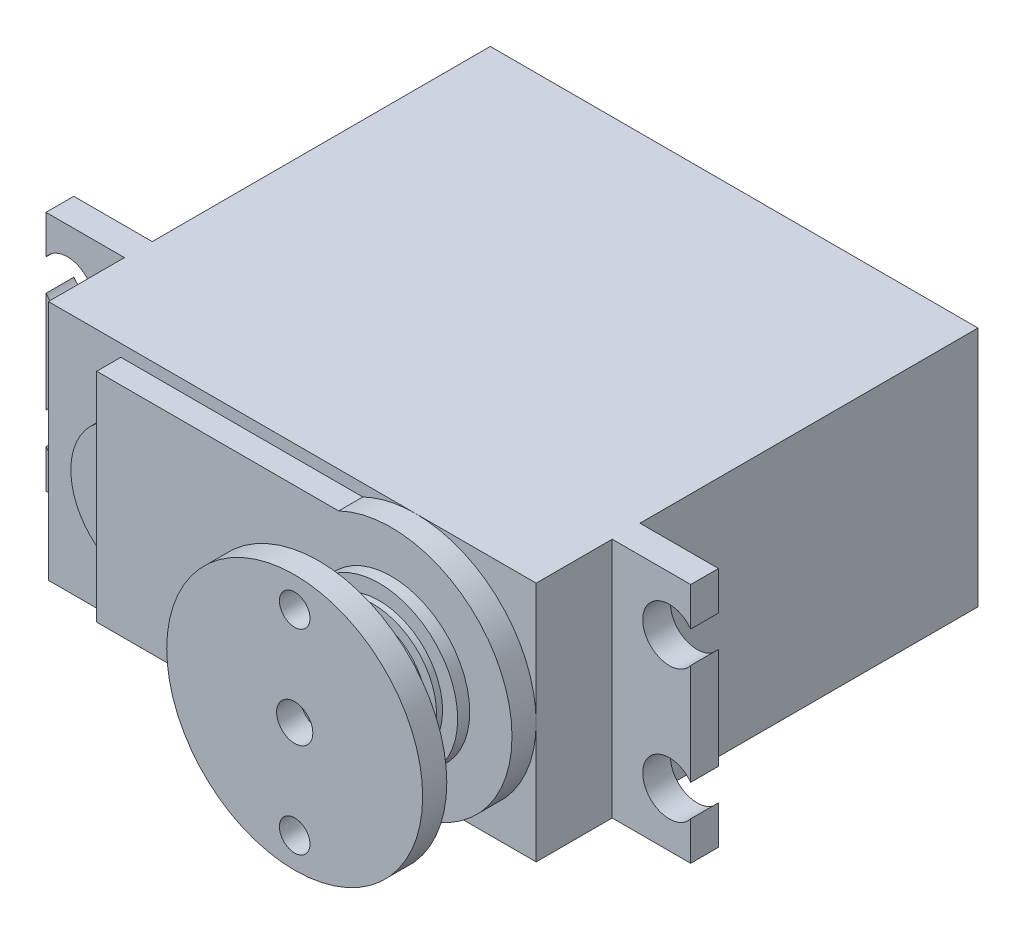
ISO-10303-21;
HEADER;
FILE_DESCRIPTION(('STEP AP214'),'2;1');
FILE_NAME('part.step','',(''),(''),'','','');
FILE_SCHEMA(('AUTOMOTIVE_DESIGN { 1 0 10303 214 1 1 1 1 }'));
ENDSEC;
DATA;
#1=APPLICATION_CONTEXT('core data for automotive mechanical design processes');
#2=APPLICATION_PROTOCOL_DEFINITION('international standard','automotive_design',2000,#1);
#3=PRODUCT_CONTEXT('',#1,'mechanical');
#4=PRODUCT('Part','Part','',(#3));
#5=PRODUCT_RELATED_PRODUCT_CATEGORY('part','',(#4));
#6=PRODUCT_DEFINITION_FORMATION('','',#4);
#7=PRODUCT_DEFINITION_CONTEXT('part definition',#1,'design');
#8=PRODUCT_DEFINITION('design','',#6,#7);
#9=PRODUCT_DEFINITION_SHAPE('','',#8);
#10=(LENGTH_UNIT() NAMED_UNIT(*) SI_UNIT(.MILLI.,.METRE.));
#11=(NAMED_UNIT(*) PLANE_ANGLE_UNIT() SI_UNIT($,.RADIAN.));
#12=(NAMED_UNIT(*) SI_UNIT($,.STERADIAN.) SOLID_ANGLE_UNIT());
#13=UNCERTAINTY_MEASURE_WITH_UNIT(LENGTH_MEASURE(1.E-05),#10,'distance_accuracy_value','');
#14=(GEOMETRIC_REPRESENTATION_CONTEXT(3) GLOBAL_UNCERTAINTY_ASSIGNED_CONTEXT((#13)) GLOBAL_UNIT_ASSIGNED_CONTEXT((#10,
#11,#12)) REPRESENTATION_CONTEXT('',''));
#15=CARTESIAN_POINT('',(0.,0.,0.));
#16=DIRECTION('',(0.,0.,1.));
#17=DIRECTION('',(1.,0.,0.));
#18=AXIS2_PLACEMENT_3D('',#15,#16,#17);
#19=CARTESIAN_POINT('',(-14.2,0.,38.6));
#20=DIRECTION('',(1.,0.,0.));
#21=DIRECTION('',(0.,0.,-1.));
#22=AXIS2_PLACEMENT_3D('',#19,#20,#21);
#23=PLANE('',#22);
#24=DIRECTION('',(0.,0.,-1.));
#25=VECTOR('',#24,1.);
#26=CARTESIAN_POINT('',(-14.2,-4.39928396599425,38.1));
#27=LINE('',#26,#25);
#28=CARTESIAN_POINT('',(-14.2,-4.39928396599425,38.1));
#29=VERTEX_POINT('',#28);
#30=CARTESIAN_POINT('',(-14.2,-4.39928396599425,36.6));
#31=VERTEX_POINT('',#30);
#32=EDGE_CURVE('E52',#29,#31,#27,.T.);
#33=ORIENTED_EDGE('',*,*,#32,.T.);
#34=DIRECTION('',(0.,-1.,0.));
#35=VECTOR('',#34,1.);
#36=CARTESIAN_POINT('',(-14.2,0.,36.6));
#37=LINE('',#36,#35);
#38=CARTESIAN_POINT('',(-14.2,-9.,36.6));
#39=VERTEX_POINT('',#38);
#40=EDGE_CURVE('E59',#31,#39,#37,.T.);
#41=ORIENTED_EDGE('',*,*,#40,.T.);
#42=DIRECTION('',(0.,0.,-1.));
#43=VECTOR('',#42,1.);
#44=CARTESIAN_POINT('',(-14.2,-9.,38.6));
#45=LINE('',#44,#43);
#46=CARTESIAN_POINT('',(-14.2,-9.,38.6));
#47=VERTEX_POINT('',#46);
#48=EDGE_CURVE('E250',#47,#39,#45,.T.);
#49=ORIENTED_EDGE('',*,*,#48,.F.);
#50=DIRECTION('',(0.,-1.,0.));
#51=VECTOR('',#50,1.);
#52=CARTESIAN_POINT('',(-14.2,0.,38.6));
#53=LINE('',#52,#51);
#54=CARTESIAN_POINT('',(-14.2,9.,38.6));
#55=VERTEX_POINT('',#54);
#56=EDGE_CURVE('E249',#55,#47,#53,.T.);
#57=ORIENTED_EDGE('',*,*,#56,.F.);
#58=DIRECTION('',(0.,0.,-1.));
#59=VECTOR('',#58,1.);
#60=CARTESIAN_POINT('',(-14.2,9.,38.6));
#61=LINE('',#60,#59);
#62=CARTESIAN_POINT('',(-14.2,9.,36.6));
#63=VERTEX_POINT('',#62);
#64=EDGE_CURVE('E261',#55,#63,#61,.T.);
#65=ORIENTED_EDGE('',*,*,#64,.T.);
#66=CARTESIAN_POINT('',(-14.2,5.10071603400575,36.6));
#67=VERTEX_POINT('',#66);
#68=EDGE_CURVE('E232',#63,#67,#37,.T.);
#69=ORIENTED_EDGE('',*,*,#68,.T.);
#70=DIRECTION('',(0.,0.,-1.));
#71=VECTOR('',#70,1.);
#72=CARTESIAN_POINT('',(-14.2,5.10071603400575,38.1));
#73=LINE('',#72,#71);
#74=CARTESIAN_POINT('',(-14.2,5.10071603400575,38.1));
#75=VERTEX_POINT('',#74);
#76=EDGE_CURVE('E221',#75,#67,#73,.T.);
#77=ORIENTED_EDGE('',*,*,#76,.F.);
#78=DIRECTION('',(0.,1.,0.));
#79=VECTOR('',#78,1.);
#80=CARTESIAN_POINT('',(-14.2,0.,38.1));
#81=LINE('',#80,#79);
#82=EDGE_CURVE('E225',#29,#75,#81,.T.);
#83=ORIENTED_EDGE('',*,*,#82,.F.);
#84=EDGE_LOOP('',(#33,#41,#49,#57,#65,#69,#77,#83));
#85=FACE_BOUND('',#84,.T.);
#86=ADVANCED_FACE('F35',(#85),#23,.F.);
#87=CARTESIAN_POINT('',(0.,0.,36.6));
#88=DIRECTION('',(0.,0.,1.));
#89=DIRECTION('',(1.,0.,0.));
#90=AXIS2_PLACEMENT_3D('',#87,#88,#89);
#91=PLANE('',#90);
#92=ORIENTED_EDGE('',*,*,#40,.F.);
#93=CARTESIAN_POINT('',(-11.2524163403873,0.350716034005753,36.6));
#94=DIRECTION('',(0.,0.,1.));
#95=DIRECTION('',(1.,0.,0.));
#96=AXIS2_PLACEMENT_3D('',#93,#94,#95);
#97=CIRCLE('',#96,5.59023697444177);
#98=EDGE_CURVE('E228',#67,#31,#97,.T.);
#99=ORIENTED_EDGE('',*,*,#98,.F.);
#100=ORIENTED_EDGE('',*,*,#68,.F.);
#101=DIRECTION('',(1.,0.,0.));
#102=VECTOR('',#101,1.);
#103=CARTESIAN_POINT('',(0.,9.,36.6));
#104=LINE('',#103,#102);
#105=CARTESIAN_POINT('',(5.84110105645932,9.,36.6));
#106=VERTEX_POINT('',#105);
#107=EDGE_CURVE('E254',#63,#106,#104,.T.);
#108=ORIENTED_EDGE('',*,*,#107,.T.);
#109=CARTESIAN_POINT('',(10.2,0.,36.6));
#110=DIRECTION('',(0.,0.,1.));
#111=DIRECTION('',(1.,0.,0.));
#112=AXIS2_PLACEMENT_3D('',#109,#110,#111);
#113=CIRCLE('',#112,10.);
#114=CARTESIAN_POINT('',(10.2,10.,36.6));
#115=VERTEX_POINT('',#114);
#116=EDGE_CURVE('E256',#115,#106,#113,.T.);
#117=ORIENTED_EDGE('',*,*,#116,.F.);
#118=DIRECTION('',(-1.,0.,0.));
#119=VECTOR('',#118,1.);
#120=CARTESIAN_POINT('',(-20.2,10.,36.6));
#121=LINE('',#120,#119);
#122=CARTESIAN_POINT('',(-20.2,10.,36.6));
#123=VERTEX_POINT('',#122);
#124=EDGE_CURVE('E357',#115,#123,#121,.T.);
#125=ORIENTED_EDGE('',*,*,#124,.T.);
#126=DIRECTION('',(0.,-1.,0.));
#127=VECTOR('',#126,1.);
#128=CARTESIAN_POINT('',(-20.2,10.,36.6));
#129=LINE('',#128,#127);
#130=CARTESIAN_POINT('',(-20.2,-10.,36.6));
#131=VERTEX_POINT('',#130);
#132=EDGE_CURVE('E362',#123,#131,#129,.T.);
#133=ORIENTED_EDGE('',*,*,#132,.T.);
#134=DIRECTION('',(1.,0.,0.));
#135=VECTOR('',#134,1.);
#136=CARTESIAN_POINT('',(-20.2,-10.,36.6));
#137=LINE('',#136,#135);
#138=CARTESIAN_POINT('',(10.2,-10.,36.6));
#139=VERTEX_POINT('',#138);
#140=EDGE_CURVE('E365',#131,#139,#137,.T.);
#141=ORIENTED_EDGE('',*,*,#140,.T.);
#142=CARTESIAN_POINT('',(5.84110105645932,-9.,36.6));
#143=VERTEX_POINT('',#142);
#144=EDGE_CURVE('E236',#143,#139,#113,.T.);
#145=ORIENTED_EDGE('',*,*,#144,.F.);
#146=DIRECTION('',(1.,0.,0.));
#147=VECTOR('',#146,1.);
#148=CARTESIAN_POINT('',(0.,-9.,36.6));
#149=LINE('',#148,#147);
#150=EDGE_CURVE('E233',#39,#143,#149,.T.);
#151=ORIENTED_EDGE('',*,*,#150,.F.);
#152=EDGE_LOOP('',(#92,#99,#100,#108,#117,#125,#133,#141,#145,#151));
#153=FACE_BOUND('',#152,.T.);
#154=ADVANCED_FACE('F435',(#153),#91,.T.);
#155=CARTESIAN_POINT('',(20.2,0.,36.6));
#156=VERTEX_POINT('',#155);
#157=EDGE_CURVE('E255',#139,#156,#113,.T.);
#158=ORIENTED_EDGE('',*,*,#157,.F.);
#159=CARTESIAN_POINT('',(20.2,-10.,36.6));
#160=VERTEX_POINT('',#159);
#161=EDGE_CURVE('E364',#139,#160,#137,.T.);
#162=ORIENTED_EDGE('',*,*,#161,.T.);
#163=DIRECTION('',(0.,1.,0.));
#164=VECTOR('',#163,1.);
#165=CARTESIAN_POINT('',(20.2,10.,36.6));
#166=LINE('',#165,#164);
#167=EDGE_CURVE('E354',#160,#156,#166,.T.);
#168=ORIENTED_EDGE('',*,*,#167,.T.);
#169=EDGE_LOOP('',(#158,#162,#168));
#170=FACE_BOUND('',#169,.T.);
#171=ADVANCED_FACE('F460',(#170),#91,.T.);
#172=CARTESIAN_POINT('',(-26.7,0.,0.));
#173=DIRECTION('',(-1.,0.,0.));
#174=DIRECTION('',(0.,1.,0.));
#175=AXIS2_PLACEMENT_3D('',#172,#173,#174);
#176=PLANE('',#175);
#177=DIRECTION('',(0.,1.,0.));
#178=VECTOR('',#177,1.);
#179=CARTESIAN_POINT('',(-26.7,0.,30.3));
#180=LINE('',#179,#178);
#181=CARTESIAN_POINT('',(-26.7,-10.,30.3));
#182=VERTEX_POINT('',#181);
#183=CARTESIAN_POINT('',(-26.7,-6.80554248860253,30.3));
#184=VERTEX_POINT('',#183);
#185=EDGE_CURVE('E282',#182,#184,#180,.T.);
#186=ORIENTED_EDGE('',*,*,#185,.T.);
#187=DIRECTION('',(0.,0.,1.));
#188=VECTOR('',#187,1.);
#189=CARTESIAN_POINT('',(-26.7,-6.80554248860253,23.8));
#190=LINE('',#189,#188);
#191=CARTESIAN_POINT('',(-26.7,-6.80554248860253,28.));
#192=VERTEX_POINT('',#191);
#193=EDGE_CURVE('E39',#184,#192,#190,.F.);
#194=ORIENTED_EDGE('',*,*,#193,.T.);
#195=DIRECTION('',(0.,1.,0.));
#196=VECTOR('',#195,1.);
#197=CARTESIAN_POINT('',(-26.7,0.,28.));
#198=LINE('',#197,#196);
#199=CARTESIAN_POINT('',(-26.7,-10.,28.));
#200=VERTEX_POINT('',#199);
#201=EDGE_CURVE('E291',#200,#192,#198,.T.);
#202=ORIENTED_EDGE('',*,*,#201,.F.);
#203=DIRECTION('',(0.,0.,-1.));
#204=VECTOR('',#203,1.);
#205=CARTESIAN_POINT('',(-26.7,-10.,0.));
#206=LINE('',#205,#204);
#207=EDGE_CURVE('E294',#182,#200,#206,.T.);
#208=ORIENTED_EDGE('',*,*,#207,.F.);
#209=EDGE_LOOP('',(#186,#194,#202,#208));
#210=FACE_BOUND('',#209,.T.);
#211=ADVANCED_FACE('F728',(#210),#176,.T.);
#212=CARTESIAN_POINT('',(-26.7,-4.19445751139747,28.));
#213=VERTEX_POINT('',#212);
#214=CARTESIAN_POINT('',(-26.7,4.19445751139746,28.));
#215=VERTEX_POINT('',#214);
#216=EDGE_CURVE('E295',#213,#215,#198,.T.);
#217=ORIENTED_EDGE('',*,*,#216,.F.);
#218=DIRECTION('',(0.,0.,1.));
#219=VECTOR('',#218,1.);
#220=CARTESIAN_POINT('',(-26.7,-4.19445751139747,23.8));
#221=LINE('',#220,#219);
#222=CARTESIAN_POINT('',(-26.7,-4.19445751139747,30.3));
#223=VERTEX_POINT('',#222);
#224=EDGE_CURVE('E407',#213,#223,#221,.T.);
#225=ORIENTED_EDGE('',*,*,#224,.T.);
#226=CARTESIAN_POINT('',(-26.7,4.19445751139747,30.3));
#227=VERTEX_POINT('',#226);
#228=EDGE_CURVE('E286',#223,#227,#180,.T.);
#229=ORIENTED_EDGE('',*,*,#228,.T.);
#230=DIRECTION('',(0.,0.,1.));
#231=VECTOR('',#230,1.);
#232=CARTESIAN_POINT('',(-26.7,4.19445751139747,23.8));
#233=LINE('',#232,#231);
#234=EDGE_CURVE('E405',#227,#215,#233,.F.);
#235=ORIENTED_EDGE('',*,*,#234,.T.);
#236=EDGE_LOOP('',(#217,#225,#229,#235));
#237=FACE_BOUND('',#236,.T.);
#238=ADVANCED_FACE('F507',(#237),#176,.T.);
#239=CARTESIAN_POINT('',(-26.7,6.80554248860253,28.));
#240=VERTEX_POINT('',#239);
#241=CARTESIAN_POINT('',(-26.7,10.,28.));
#242=VERTEX_POINT('',#241);
#243=EDGE_CURVE('E290',#240,#242,#198,.T.);
#244=ORIENTED_EDGE('',*,*,#243,.F.);
#245=DIRECTION('',(0.,0.,1.));
#246=VECTOR('',#245,1.);
#247=CARTESIAN_POINT('',(-26.7,6.80554248860253,23.8));
#248=LINE('',#247,#246);
#249=CARTESIAN_POINT('',(-26.7,6.80554248860253,30.3));
#250=VERTEX_POINT('',#249);
#251=EDGE_CURVE('E402',#240,#250,#248,.T.);
#252=ORIENTED_EDGE('',*,*,#251,.T.);
#253=CARTESIAN_POINT('',(-26.7,10.,30.3));
#254=VERTEX_POINT('',#253);
#255=EDGE_CURVE('E287',#250,#254,#180,.T.);
#256=ORIENTED_EDGE('',*,*,#255,.T.);
#257=DIRECTION('',(0.,0.,1.));
#258=VECTOR('',#257,1.);
#259=CARTESIAN_POINT('',(-26.7,10.,0.));
#260=LINE('',#259,#258);
#261=EDGE_CURVE('E285',#242,#254,#260,.T.);
#262=ORIENTED_EDGE('',*,*,#261,.F.);
#263=EDGE_LOOP('',(#244,#252,#256,#262));
#264=FACE_BOUND('',#263,.T.);
#265=ADVANCED_FACE('F514',(#264),#176,.T.);
#266=CARTESIAN_POINT('',(-20.2,10.,36.6));
#267=DIRECTION('',(1.,0.,0.));
#268=DIRECTION('',(0.,1.,0.));
#269=AXIS2_PLACEMENT_3D('',#266,#267,#268);
#270=PLANE('',#269);
#271=DIRECTION('',(0.,1.,0.));
#272=VECTOR('',#271,1.);
#273=CARTESIAN_POINT('',(-20.2,0.,30.3));
#274=LINE('',#273,#272);
#275=CARTESIAN_POINT('',(-20.2,-10.,30.3));
#276=VERTEX_POINT('',#275);
#277=CARTESIAN_POINT('',(-20.2,10.,30.3));
#278=VERTEX_POINT('',#277);
#279=EDGE_CURVE('E281',#276,#278,#274,.T.);
#280=ORIENTED_EDGE('',*,*,#279,.F.);
#281=DIRECTION('',(0.,0.,-1.));
#282=VECTOR('',#281,1.);
#283=CARTESIAN_POINT('',(-20.2,-10.,36.6));
#284=LINE('',#283,#282);
#285=EDGE_CURVE('E383',#131,#276,#284,.T.);
#286=ORIENTED_EDGE('',*,*,#285,.F.);
#287=ORIENTED_EDGE('',*,*,#132,.F.);
#288=DIRECTION('',(0.,0.,-1.));
#289=VECTOR('',#288,1.);
#290=CARTESIAN_POINT('',(-20.2,10.,36.6));
#291=LINE('',#290,#289);
#292=EDGE_CURVE('E387',#123,#278,#291,.T.);
#293=ORIENTED_EDGE('',*,*,#292,.T.);
#294=EDGE_LOOP('',(#280,#286,#287,#293));
#295=FACE_BOUND('',#294,.T.);
#296=ADVANCED_FACE('F519',(#295),#270,.F.);
#297=CARTESIAN_POINT('',(26.7,0.,0.));
#298=DIRECTION('',(1.,0.,0.));
#299=DIRECTION('',(0.,1.,0.));
#300=AXIS2_PLACEMENT_3D('',#297,#298,#299);
#301=PLANE('',#300);
#302=DIRECTION('',(0.,0.,1.));
#303=VECTOR('',#302,1.);
#304=CARTESIAN_POINT('',(26.7,-4.19445751139747,23.8));
#305=LINE('',#304,#303);
#306=CARTESIAN_POINT('',(26.7,-4.19445751139747,28.));
#307=VERTEX_POINT('',#306);
#308=CARTESIAN_POINT('',(26.7,-4.19445751139747,30.3));
#309=VERTEX_POINT('',#308);
#310=EDGE_CURVE('E400',#307,#309,#305,.T.);
#311=ORIENTED_EDGE('',*,*,#310,.F.);
#312=DIRECTION('',(0.,1.,0.));
#313=VECTOR('',#312,1.);
#314=CARTESIAN_POINT('',(26.7,0.,28.));
#315=LINE('',#314,#313);
#316=CARTESIAN_POINT('',(26.7,4.19445751139747,28.));
#317=VERTEX_POINT('',#316);
#318=EDGE_CURVE('E334',#307,#317,#315,.T.);
#319=ORIENTED_EDGE('',*,*,#318,.T.);
#320=DIRECTION('',(0.,0.,1.));
#321=VECTOR('',#320,1.);
#322=CARTESIAN_POINT('',(26.7,4.19445751139747,23.8));
#323=LINE('',#322,#321);
#324=CARTESIAN_POINT('',(26.7,4.19445751139747,30.3));
#325=VERTEX_POINT('',#324);
#326=EDGE_CURVE('E394',#325,#317,#323,.F.);
#327=ORIENTED_EDGE('',*,*,#326,.F.);
#328=DIRECTION('',(0.,1.,0.));
#329=VECTOR('',#328,1.);
#330=CARTESIAN_POINT('',(26.7,0.,30.3));
#331=LINE('',#330,#329);
#332=EDGE_CURVE('E326',#309,#325,#331,.T.);
#333=ORIENTED_EDGE('',*,*,#332,.F.);
#334=EDGE_LOOP('',(#311,#319,#327,#333));
#335=FACE_BOUND('',#334,.T.);
#336=ADVANCED_FACE('F752',(#335),#301,.T.);
#337=DIRECTION('',(0.,0.,1.));
#338=VECTOR('',#337,1.);
#339=CARTESIAN_POINT('',(26.7,6.80554248860253,23.8));
#340=LINE('',#339,#338);
#341=CARTESIAN_POINT('',(26.7,6.80554248860253,28.));
#342=VERTEX_POINT('',#341);
#343=CARTESIAN_POINT('',(26.7,6.80554248860253,30.3));
#344=VERTEX_POINT('',#343);
#345=EDGE_CURVE('E396',#342,#344,#340,.T.);
#346=ORIENTED_EDGE('',*,*,#345,.F.);
#347=CARTESIAN_POINT('',(26.7,10.,28.));
#348=VERTEX_POINT('',#347);
#349=EDGE_CURVE('E329',#342,#348,#315,.T.);
#350=ORIENTED_EDGE('',*,*,#349,.T.);
#351=DIRECTION('',(0.,0.,1.));
#352=VECTOR('',#351,1.);
#353=CARTESIAN_POINT('',(26.7,10.,0.));
#354=LINE('',#353,#352);
#355=CARTESIAN_POINT('',(26.7,10.,30.3));
#356=VERTEX_POINT('',#355);
#357=EDGE_CURVE('E333',#348,#356,#354,.T.);
#358=ORIENTED_EDGE('',*,*,#357,.T.);
#359=EDGE_CURVE('E327',#344,#356,#331,.T.);
#360=ORIENTED_EDGE('',*,*,#359,.F.);
#361=EDGE_LOOP('',(#346,#350,#358,#360));
#362=FACE_BOUND('',#361,.T.);
#363=ADVANCED_FACE('F478',(#362),#301,.T.);
#364=CARTESIAN_POINT('',(20.2,10.,36.6));
#365=DIRECTION('',(-1.,0.,0.));
#366=DIRECTION('',(0.,-1.,0.));
#367=AXIS2_PLACEMENT_3D('',#364,#365,#366);
#368=PLANE('',#367);
#369=DIRECTION('',(0.,1.,0.));
#370=VECTOR('',#369,1.);
#371=CARTESIAN_POINT('',(20.2,0.,28.));
#372=LINE('',#371,#370);
#373=CARTESIAN_POINT('',(20.2,-10.,28.));
#374=VERTEX_POINT('',#373);
#375=CARTESIAN_POINT('',(20.2,10.,28.));
#376=VERTEX_POINT('',#375);
#377=EDGE_CURVE('E339',#374,#376,#372,.T.);
#378=ORIENTED_EDGE('',*,*,#377,.F.);
#379=DIRECTION('',(0.,0.,-1.));
#380=VECTOR('',#379,1.);
#381=CARTESIAN_POINT('',(20.2,-10.,36.6));
#382=LINE('',#381,#380);
#383=CARTESIAN_POINT('',(20.2,-10.,0.));
#384=VERTEX_POINT('',#383);
#385=EDGE_CURVE('E368',#374,#384,#382,.T.);
#386=ORIENTED_EDGE('',*,*,#385,.T.);
#387=DIRECTION('',(0.,1.,0.));
#388=VECTOR('',#387,1.);
#389=CARTESIAN_POINT('',(20.2,10.,0.));
#390=LINE('',#389,#388);
#391=CARTESIAN_POINT('',(20.2,10.,0.));
#392=VERTEX_POINT('',#391);
#393=EDGE_CURVE('E353',#384,#392,#390,.T.);
#394=ORIENTED_EDGE('',*,*,#393,.T.);
#395=DIRECTION('',(0.,0.,-1.));
#396=VECTOR('',#395,1.);
#397=CARTESIAN_POINT('',(20.2,10.,36.6));
#398=LINE('',#397,#396);
#399=EDGE_CURVE('E390',#376,#392,#398,.T.);
#400=ORIENTED_EDGE('',*,*,#399,.F.);
#401=EDGE_LOOP('',(#378,#386,#394,#400));
#402=FACE_BOUND('',#401,.T.);
#403=ADVANCED_FACE('F489',(#402),#368,.F.);
#404=CARTESIAN_POINT('',(20.2,-10.,30.3));
#405=VERTEX_POINT('',#404);
#406=EDGE_CURVE('E380',#160,#405,#382,.T.);
#407=ORIENTED_EDGE('',*,*,#406,.T.);
#408=DIRECTION('',(0.,1.,0.));
#409=VECTOR('',#408,1.);
#410=CARTESIAN_POINT('',(20.2,0.,30.3));
#411=LINE('',#410,#409);
#412=CARTESIAN_POINT('',(20.2,10.,30.3));
#413=VERTEX_POINT('',#412);
#414=EDGE_CURVE('E321',#405,#413,#411,.T.);
#415=ORIENTED_EDGE('',*,*,#414,.T.);
#416=CARTESIAN_POINT('',(20.2,10.,36.6));
#417=VERTEX_POINT('',#416);
#418=EDGE_CURVE('E391',#417,#413,#398,.T.);
#419=ORIENTED_EDGE('',*,*,#418,.F.);
#420=EDGE_CURVE('E358',#156,#417,#166,.T.);
#421=ORIENTED_EDGE('',*,*,#420,.F.);
#422=ORIENTED_EDGE('',*,*,#167,.F.);
#423=EDGE_LOOP('',(#407,#415,#419,#421,#422));
#424=FACE_BOUND('',#423,.T.);
#425=ADVANCED_FACE('F37',(#424),#368,.F.);
#426=CARTESIAN_POINT('',(-20.2,10.,36.6));
#427=DIRECTION('',(0.,-1.,0.));
#428=DIRECTION('',(0.,0.,-1.));
#429=AXIS2_PLACEMENT_3D('',#426,#427,#428);
#430=PLANE('',#429);
#431=DIRECTION('',(-1.,0.,0.));
#432=VECTOR('',#431,1.);
#433=CARTESIAN_POINT('',(-20.2,10.,0.));
#434=LINE('',#433,#432);
#435=CARTESIAN_POINT('',(-20.2,10.,0.));
#436=VERTEX_POINT('',#435);
#437=EDGE_CURVE('E371',#392,#436,#434,.T.);
#438=ORIENTED_EDGE('',*,*,#437,.T.);
#439=CARTESIAN_POINT('',(-20.2,10.,28.));
#440=VERTEX_POINT('',#439);
#441=EDGE_CURVE('E386',#440,#436,#291,.T.);
#442=ORIENTED_EDGE('',*,*,#441,.F.);
#443=DIRECTION('',(1.,0.,0.));
#444=VECTOR('',#443,1.);
#445=CARTESIAN_POINT('',(-26.7,10.,28.));
#446=LINE('',#445,#444);
#447=EDGE_CURVE('E307',#242,#440,#446,.T.);
#448=ORIENTED_EDGE('',*,*,#447,.F.);
#449=ORIENTED_EDGE('',*,*,#261,.T.);
#450=DIRECTION('',(1.,0.,0.));
#451=VECTOR('',#450,1.);
#452=CARTESIAN_POINT('',(-26.7,10.,30.3));
#453=LINE('',#452,#451);
#454=EDGE_CURVE('E309',#254,#278,#453,.T.);
#455=ORIENTED_EDGE('',*,*,#454,.T.);
#456=ORIENTED_EDGE('',*,*,#292,.F.);
#457=ORIENTED_EDGE('',*,*,#124,.F.);
#458=EDGE_CURVE('E359',#417,#115,#121,.T.);
#459=ORIENTED_EDGE('',*,*,#458,.F.);
#460=ORIENTED_EDGE('',*,*,#418,.T.);
#461=DIRECTION('',(-1.,0.,0.));
#462=VECTOR('',#461,1.);
#463=CARTESIAN_POINT('',(26.7,10.,30.3));
#464=LINE('',#463,#462);
#465=EDGE_CURVE('E337',#356,#413,#464,.T.);
#466=ORIENTED_EDGE('',*,*,#465,.F.);
#467=ORIENTED_EDGE('',*,*,#357,.F.);
#468=DIRECTION('',(-1.,0.,0.));
#469=VECTOR('',#468,1.);
#470=CARTESIAN_POINT('',(26.7,10.,28.));
#471=LINE('',#470,#469);
#472=EDGE_CURVE('E344',#348,#376,#471,.T.);
#473=ORIENTED_EDGE('',*,*,#472,.T.);
#474=ORIENTED_EDGE('',*,*,#399,.T.);
#475=EDGE_LOOP('',(#438,#442,#448,#449,#455,#456,#457,#459,#460,#466,#467,#473,#474));
#476=FACE_BOUND('',#475,.T.);
#477=ADVANCED_FACE('F451',(#476),#430,.F.);
#478=CARTESIAN_POINT('',(-20.2,-10.,28.));
#479=VERTEX_POINT('',#478);
#480=CARTESIAN_POINT('',(-20.2,-10.,0.));
#481=VERTEX_POINT('',#480);
#482=EDGE_CURVE('E382',#479,#481,#284,.T.);
#483=ORIENTED_EDGE('',*,*,#482,.F.);
#484=DIRECTION('',(0.,1.,0.));
#485=VECTOR('',#484,1.);
#486=CARTESIAN_POINT('',(-20.2,0.,28.));
#487=LINE('',#486,#485);
#488=EDGE_CURVE('E301',#479,#440,#487,.T.);
#489=ORIENTED_EDGE('',*,*,#488,.T.);
#490=ORIENTED_EDGE('',*,*,#441,.T.);
#491=DIRECTION('',(0.,-1.,0.));
#492=VECTOR('',#491,1.);
#493=CARTESIAN_POINT('',(-20.2,10.,0.));
#494=LINE('',#493,#492);
#495=EDGE_CURVE('E374',#436,#481,#494,.T.);
#496=ORIENTED_EDGE('',*,*,#495,.T.);
#497=EDGE_LOOP('',(#483,#489,#490,#496));
#498=FACE_BOUND('',#497,.T.);
#499=ADVANCED_FACE('F500',(#498),#270,.F.);
#500=CARTESIAN_POINT('',(-20.2,-10.,36.6));
#501=DIRECTION('',(0.,1.,0.));
#502=DIRECTION('',(0.,0.,1.));
#503=AXIS2_PLACEMENT_3D('',#500,#501,#502);
#504=PLANE('',#503);
#505=DIRECTION('',(1.,0.,0.));
#506=VECTOR('',#505,1.);
#507=CARTESIAN_POINT('',(-20.2,-10.,0.));
#508=LINE('',#507,#506);
#509=EDGE_CURVE('E377',#481,#384,#508,.T.);
#510=ORIENTED_EDGE('',*,*,#509,.T.);
#511=ORIENTED_EDGE('',*,*,#385,.F.);
#512=DIRECTION('',(-1.,0.,0.));
#513=VECTOR('',#512,1.);
#514=CARTESIAN_POINT('',(26.7,-10.,28.));
#515=LINE('',#514,#513);
#516=CARTESIAN_POINT('',(26.7,-10.,28.));
#517=VERTEX_POINT('',#516);
#518=EDGE_CURVE('E347',#517,#374,#515,.T.);
#519=ORIENTED_EDGE('',*,*,#518,.F.);
#520=DIRECTION('',(0.,0.,-1.));
#521=VECTOR('',#520,1.);
#522=CARTESIAN_POINT('',(26.7,-10.,0.));
#523=LINE('',#522,#521);
#524=CARTESIAN_POINT('',(26.7,-10.,30.3));
#525=VERTEX_POINT('',#524);
#526=EDGE_CURVE('E325',#525,#517,#523,.T.);
#527=ORIENTED_EDGE('',*,*,#526,.F.);
#528=DIRECTION('',(-1.,0.,0.));
#529=VECTOR('',#528,1.);
#530=CARTESIAN_POINT('',(26.7,-10.,30.3));
#531=LINE('',#530,#529);
#532=EDGE_CURVE('E350',#525,#405,#531,.T.);
#533=ORIENTED_EDGE('',*,*,#532,.T.);
#534=ORIENTED_EDGE('',*,*,#406,.F.);
#535=ORIENTED_EDGE('',*,*,#161,.F.);
#536=ORIENTED_EDGE('',*,*,#140,.F.);
#537=ORIENTED_EDGE('',*,*,#285,.T.);
#538=DIRECTION('',(1.,0.,0.));
#539=VECTOR('',#538,1.);
#540=CARTESIAN_POINT('',(-26.7,-10.,30.3));
#541=LINE('',#540,#539);
#542=EDGE_CURVE('E298',#182,#276,#541,.T.);
#543=ORIENTED_EDGE('',*,*,#542,.F.);
#544=ORIENTED_EDGE('',*,*,#207,.T.);
#545=DIRECTION('',(1.,0.,0.));
#546=VECTOR('',#545,1.);
#547=CARTESIAN_POINT('',(-26.7,-10.,28.));
#548=LINE('',#547,#546);
#549=EDGE_CURVE('E305',#200,#479,#548,.T.);
#550=ORIENTED_EDGE('',*,*,#549,.T.);
#551=ORIENTED_EDGE('',*,*,#482,.T.);
#552=EDGE_LOOP('',(#510,#511,#519,#527,#533,#534,#535,#536,#537,#543,#544,#550,#551));
#553=FACE_BOUND('',#552,.T.);
#554=ADVANCED_FACE('F465',(#553),#504,.F.);
#555=EDGE_CURVE('E417',#156,#115,#113,.T.);
#556=ORIENTED_EDGE('',*,*,#555,.F.);
#557=ORIENTED_EDGE('',*,*,#420,.T.);
#558=ORIENTED_EDGE('',*,*,#458,.T.);
#559=EDGE_LOOP('',(#556,#557,#558));
#560=FACE_BOUND('',#559,.T.);
#561=ADVANCED_FACE('F455',(#560),#91,.T.);
#562=CARTESIAN_POINT('',(0.,0.,0.));
#563=DIRECTION('',(0.,0.,1.));
#564=DIRECTION('',(1.,0.,0.));
#565=AXIS2_PLACEMENT_3D('',#562,#563,#564);
#566=PLANE('',#565);
#567=ORIENTED_EDGE('',*,*,#393,.F.);
#568=ORIENTED_EDGE('',*,*,#509,.F.);
#569=ORIENTED_EDGE('',*,*,#495,.F.);
#570=ORIENTED_EDGE('',*,*,#437,.F.);
#571=EDGE_LOOP('',(#567,#568,#569,#570));
#572=FACE_BOUND('',#571,.T.);
#573=ADVANCED_FACE('F495',(#572),#566,.F.);
#574=CARTESIAN_POINT('',(26.7,0.,30.3));
#575=DIRECTION('',(0.,0.,1.));
#576=DIRECTION('',(1.,0.,0.));
#577=AXIS2_PLACEMENT_3D('',#574,#575,#576);
#578=PLANE('',#577);
#579=CARTESIAN_POINT('',(24.9292490828878,-5.5,30.3));
#580=DIRECTION('',(0.,0.,1.));
#581=DIRECTION('',(1.,0.,0.));
#582=AXIS2_PLACEMENT_3D('',#579,#580,#581);
#583=CIRCLE('',#582,2.2);
#584=CARTESIAN_POINT('',(26.7,-6.80554248860253,30.3));
#585=VERTEX_POINT('',#584);
#586=EDGE_CURVE('E312',#309,#585,#583,.T.);
#587=ORIENTED_EDGE('',*,*,#586,.F.);
#588=ORIENTED_EDGE('',*,*,#332,.T.);
#589=CARTESIAN_POINT('',(24.9292490828878,5.5,30.3));
#590=DIRECTION('',(0.,0.,1.));
#591=DIRECTION('',(1.,0.,0.));
#592=AXIS2_PLACEMENT_3D('',#589,#590,#591);
#593=CIRCLE('',#592,2.2);
#594=EDGE_CURVE('E311',#344,#325,#593,.T.);
#595=ORIENTED_EDGE('',*,*,#594,.F.);
#596=ORIENTED_EDGE('',*,*,#359,.T.);
#597=ORIENTED_EDGE('',*,*,#465,.T.);
#598=ORIENTED_EDGE('',*,*,#414,.F.);
#599=ORIENTED_EDGE('',*,*,#532,.F.);
#600=EDGE_CURVE('E322',#525,#585,#331,.T.);
#601=ORIENTED_EDGE('',*,*,#600,.T.);
#602=EDGE_LOOP('',(#587,#588,#595,#596,#597,#598,#599,#601));
#603=FACE_BOUND('',#602,.T.);
#604=ADVANCED_FACE('F472',(#603),#578,.T.);
#605=CARTESIAN_POINT('',(26.7,0.,28.));
#606=DIRECTION('',(0.,0.,1.));
#607=DIRECTION('',(1.,0.,0.));
#608=AXIS2_PLACEMENT_3D('',#605,#606,#607);
#609=PLANE('',#608);
#610=ORIENTED_EDGE('',*,*,#318,.F.);
#611=CARTESIAN_POINT('',(24.9292490828878,-5.5,28.));
#612=DIRECTION('',(0.,0.,1.));
#613=DIRECTION('',(1.,0.,0.));
#614=AXIS2_PLACEMENT_3D('',#611,#612,#613);
#615=CIRCLE('',#614,2.2);
#616=CARTESIAN_POINT('',(26.7,-6.80554248860253,28.));
#617=VERTEX_POINT('',#616);
#618=EDGE_CURVE('E318',#307,#617,#615,.T.);
#619=ORIENTED_EDGE('',*,*,#618,.T.);
#620=EDGE_CURVE('E330',#517,#617,#315,.T.);
#621=ORIENTED_EDGE('',*,*,#620,.F.);
#622=ORIENTED_EDGE('',*,*,#518,.T.);
#623=ORIENTED_EDGE('',*,*,#377,.T.);
#624=ORIENTED_EDGE('',*,*,#472,.F.);
#625=ORIENTED_EDGE('',*,*,#349,.F.);
#626=CARTESIAN_POINT('',(24.9292490828878,5.5,28.));
#627=DIRECTION('',(0.,0.,1.));
#628=DIRECTION('',(1.,0.,0.));
#629=AXIS2_PLACEMENT_3D('',#626,#627,#628);
#630=CIRCLE('',#629,2.2);
#631=EDGE_CURVE('E314',#342,#317,#630,.T.);
#632=ORIENTED_EDGE('',*,*,#631,.T.);
#633=EDGE_LOOP('',(#610,#619,#621,#622,#623,#624,#625,#632));
#634=FACE_BOUND('',#633,.T.);
#635=ADVANCED_FACE('F484',(#634),#609,.F.);
#636=DIRECTION('',(0.,0.,1.));
#637=VECTOR('',#636,1.);
#638=CARTESIAN_POINT('',(26.7,-6.80554248860253,23.8));
#639=LINE('',#638,#637);
#640=EDGE_CURVE('E398',#585,#617,#639,.F.);
#641=ORIENTED_EDGE('',*,*,#640,.F.);
#642=ORIENTED_EDGE('',*,*,#600,.F.);
#643=ORIENTED_EDGE('',*,*,#526,.T.);
#644=ORIENTED_EDGE('',*,*,#620,.T.);
#645=EDGE_LOOP('',(#641,#642,#643,#644));
#646=FACE_BOUND('',#645,.T.);
#647=ADVANCED_FACE('F762',(#646),#301,.T.);
#648=CARTESIAN_POINT('',(24.9292490828878,5.5,23.8));
#649=DIRECTION('',(0.,0.,1.));
#650=DIRECTION('',(1.,0.,0.));
#651=AXIS2_PLACEMENT_3D('',#648,#649,#650);
#652=CYLINDRICAL_SURFACE('',#651,2.2);
#653=ORIENTED_EDGE('',*,*,#345,.T.);
#654=ORIENTED_EDGE('',*,*,#594,.T.);
#655=ORIENTED_EDGE('',*,*,#326,.T.);
#656=ORIENTED_EDGE('',*,*,#631,.F.);
#657=EDGE_LOOP('',(#653,#654,#655,#656));
#658=FACE_BOUND('',#657,.T.);
#659=ADVANCED_FACE('F821',(#658),#652,.F.);
#660=CARTESIAN_POINT('',(24.9292490828878,-5.5,23.8));
#661=DIRECTION('',(0.,0.,1.));
#662=DIRECTION('',(1.,0.,0.));
#663=AXIS2_PLACEMENT_3D('',#660,#661,#662);
#664=CYLINDRICAL_SURFACE('',#663,2.2);
#665=ORIENTED_EDGE('',*,*,#310,.T.);
#666=ORIENTED_EDGE('',*,*,#586,.T.);
#667=ORIENTED_EDGE('',*,*,#640,.T.);
#668=ORIENTED_EDGE('',*,*,#618,.F.);
#669=EDGE_LOOP('',(#665,#666,#667,#668));
#670=FACE_BOUND('',#669,.T.);
#671=ADVANCED_FACE('F828',(#670),#664,.F.);
#672=CARTESIAN_POINT('',(-26.7,0.,30.3));
#673=DIRECTION('',(0.,0.,-1.));
#674=DIRECTION('',(-1.,0.,0.));
#675=AXIS2_PLACEMENT_3D('',#672,#673,#674);
#676=PLANE('',#675);
#677=CARTESIAN_POINT('',(-24.9292490828878,-5.5,30.3));
#678=DIRECTION('',(0.,0.,-1.));
#679=DIRECTION('',(-1.,0.,0.));
#680=AXIS2_PLACEMENT_3D('',#677,#678,#679);
#681=CIRCLE('',#680,2.2);
#682=EDGE_CURVE('E270',#223,#184,#681,.T.);
#683=ORIENTED_EDGE('',*,*,#682,.T.);
#684=ORIENTED_EDGE('',*,*,#185,.F.);
#685=ORIENTED_EDGE('',*,*,#542,.T.);
#686=ORIENTED_EDGE('',*,*,#279,.T.);
#687=ORIENTED_EDGE('',*,*,#454,.F.);
#688=ORIENTED_EDGE('',*,*,#255,.F.);
#689=CARTESIAN_POINT('',(-24.9292490828878,5.5,30.3));
#690=DIRECTION('',(0.,0.,-1.));
#691=DIRECTION('',(-1.,0.,0.));
#692=AXIS2_PLACEMENT_3D('',#689,#690,#691);
#693=CIRCLE('',#692,2.2);
#694=EDGE_CURVE('E269',#250,#227,#693,.T.);
#695=ORIENTED_EDGE('',*,*,#694,.T.);
#696=ORIENTED_EDGE('',*,*,#228,.F.);
#697=EDGE_LOOP('',(#683,#684,#685,#686,#687,#688,#695,#696));
#698=FACE_BOUND('',#697,.T.);
#699=ADVANCED_FACE('F512',(#698),#676,.F.);
#700=CARTESIAN_POINT('',(-26.7,0.,28.));
#701=DIRECTION('',(0.,0.,-1.));
#702=DIRECTION('',(-1.,0.,0.));
#703=AXIS2_PLACEMENT_3D('',#700,#701,#702);
#704=PLANE('',#703);
#705=ORIENTED_EDGE('',*,*,#201,.T.);
#706=CARTESIAN_POINT('',(-24.9292490828878,-5.5,28.));
#707=DIRECTION('',(0.,0.,-1.));
#708=DIRECTION('',(-1.,0.,0.));
#709=AXIS2_PLACEMENT_3D('',#706,#707,#708);
#710=CIRCLE('',#709,2.2);
#711=EDGE_CURVE('E278',#192,#213,#710,.F.);
#712=ORIENTED_EDGE('',*,*,#711,.T.);
#713=ORIENTED_EDGE('',*,*,#216,.T.);
#714=CARTESIAN_POINT('',(-24.9292490828878,5.5,28.));
#715=DIRECTION('',(0.,0.,-1.));
#716=DIRECTION('',(-1.,0.,0.));
#717=AXIS2_PLACEMENT_3D('',#714,#715,#716);
#718=CIRCLE('',#717,2.2);
#719=EDGE_CURVE('E273',#215,#240,#718,.F.);
#720=ORIENTED_EDGE('',*,*,#719,.T.);
#721=ORIENTED_EDGE('',*,*,#243,.T.);
#722=ORIENTED_EDGE('',*,*,#447,.T.);
#723=ORIENTED_EDGE('',*,*,#488,.F.);
#724=ORIENTED_EDGE('',*,*,#549,.F.);
#725=EDGE_LOOP('',(#705,#712,#713,#720,#721,#722,#723,#724));
#726=FACE_BOUND('',#725,.T.);
#727=ADVANCED_FACE('F503',(#726),#704,.T.);
#728=CARTESIAN_POINT('',(-24.9292490828878,5.5,23.8));
#729=DIRECTION('',(0.,0.,1.));
#730=DIRECTION('',(1.,0.,0.));
#731=AXIS2_PLACEMENT_3D('',#728,#729,#730);
#732=CYLINDRICAL_SURFACE('',#731,2.2);
#733=ORIENTED_EDGE('',*,*,#694,.F.);
#734=ORIENTED_EDGE('',*,*,#251,.F.);
#735=ORIENTED_EDGE('',*,*,#719,.F.);
#736=ORIENTED_EDGE('',*,*,#234,.F.);
#737=EDGE_LOOP('',(#733,#734,#735,#736));
#738=FACE_BOUND('',#737,.T.);
#739=ADVANCED_FACE('F509',(#738),#732,.F.);
#740=CARTESIAN_POINT('',(-24.9292490828878,-5.5,23.8));
#741=DIRECTION('',(0.,0.,1.));
#742=DIRECTION('',(1.,0.,0.));
#743=AXIS2_PLACEMENT_3D('',#740,#741,#742);
#744=CYLINDRICAL_SURFACE('',#743,2.2);
#745=ORIENTED_EDGE('',*,*,#682,.F.);
#746=ORIENTED_EDGE('',*,*,#224,.F.);
#747=ORIENTED_EDGE('',*,*,#711,.F.);
#748=ORIENTED_EDGE('',*,*,#193,.F.);
#749=EDGE_LOOP('',(#745,#746,#747,#748));
#750=FACE_BOUND('',#749,.T.);
#751=ADVANCED_FACE('F528',(#750),#744,.F.);
#752=CARTESIAN_POINT('',(0.,-9.,38.6));
#753=DIRECTION('',(0.,1.,0.));
#754=DIRECTION('',(0.,0.,1.));
#755=AXIS2_PLACEMENT_3D('',#752,#753,#754);
#756=PLANE('',#755);
#757=ORIENTED_EDGE('',*,*,#150,.T.);
#758=DIRECTION('',(0.,0.,-1.));
#759=VECTOR('',#758,1.);
#760=CARTESIAN_POINT('',(5.84110105645932,-9.,38.6));
#761=LINE('',#760,#759);
#762=CARTESIAN_POINT('',(5.84110105645932,-9.,38.6));
#763=VERTEX_POINT('',#762);
#764=EDGE_CURVE('E266',#763,#143,#761,.T.);
#765=ORIENTED_EDGE('',*,*,#764,.F.);
#766=DIRECTION('',(1.,0.,0.));
#767=VECTOR('',#766,1.);
#768=CARTESIAN_POINT('',(0.,-9.,38.6));
#769=LINE('',#768,#767);
#770=EDGE_CURVE('E241',#47,#763,#769,.T.);
#771=ORIENTED_EDGE('',*,*,#770,.F.);
#772=ORIENTED_EDGE('',*,*,#48,.T.);
#773=EDGE_LOOP('',(#757,#765,#771,#772));
#774=FACE_BOUND('',#773,.T.);
#775=ADVANCED_FACE('F439',(#774),#756,.F.);
#776=CARTESIAN_POINT('',(10.2,0.,38.6));
#777=DIRECTION('',(0.,0.,-1.));
#778=DIRECTION('',(-1.,0.,0.));
#779=AXIS2_PLACEMENT_3D('',#776,#777,#778);
#780=CYLINDRICAL_SURFACE('',#779,10.);
#781=ORIENTED_EDGE('',*,*,#144,.T.);
#782=ORIENTED_EDGE('',*,*,#157,.T.);
#783=ORIENTED_EDGE('',*,*,#555,.T.);
#784=ORIENTED_EDGE('',*,*,#116,.T.);
#785=DIRECTION('',(0.,0.,-1.));
#786=VECTOR('',#785,1.);
#787=CARTESIAN_POINT('',(5.84110105645932,9.,38.6));
#788=LINE('',#787,#786);
#789=CARTESIAN_POINT('',(5.84110105645932,9.,38.6));
#790=VERTEX_POINT('',#789);
#791=EDGE_CURVE('E263',#790,#106,#788,.T.);
#792=ORIENTED_EDGE('',*,*,#791,.F.);
#793=CARTESIAN_POINT('',(10.2,0.,38.6));
#794=DIRECTION('',(0.,0.,1.));
#795=DIRECTION('',(1.,0.,0.));
#796=AXIS2_PLACEMENT_3D('',#793,#794,#795);
#797=CIRCLE('',#796,10.);
#798=EDGE_CURVE('E244',#763,#790,#797,.T.);
#799=ORIENTED_EDGE('',*,*,#798,.F.);
#800=ORIENTED_EDGE('',*,*,#764,.T.);
#801=EDGE_LOOP('',(#781,#782,#783,#784,#792,#799,#800));
#802=FACE_BOUND('',#801,.T.);
#803=ADVANCED_FACE('F520',(#802),#780,.T.);
#804=CARTESIAN_POINT('',(0.,9.,38.6));
#805=DIRECTION('',(0.,1.,0.));
#806=DIRECTION('',(0.,0.,1.));
#807=AXIS2_PLACEMENT_3D('',#804,#805,#806);
#808=PLANE('',#807);
#809=ORIENTED_EDGE('',*,*,#107,.F.);
#810=ORIENTED_EDGE('',*,*,#64,.F.);
#811=DIRECTION('',(1.,0.,0.));
#812=VECTOR('',#811,1.);
#813=CARTESIAN_POINT('',(0.,9.,38.6));
#814=LINE('',#813,#812);
#815=EDGE_CURVE('E246',#55,#790,#814,.T.);
#816=ORIENTED_EDGE('',*,*,#815,.T.);
#817=ORIENTED_EDGE('',*,*,#791,.T.);
#818=EDGE_LOOP('',(#809,#810,#816,#817));
#819=FACE_BOUND('',#818,.T.);
#820=ADVANCED_FACE('F446',(#819),#808,.T.);
#821=CARTESIAN_POINT('',(0.,0.,38.6));
#822=DIRECTION('',(0.,0.,1.));
#823=DIRECTION('',(1.,0.,0.));
#824=AXIS2_PLACEMENT_3D('',#821,#822,#823);
#825=PLANE('',#824);
#826=CARTESIAN_POINT('',(10.2,0.,38.6));
#827=DIRECTION('',(0.,0.,1.));
#828=DIRECTION('',(1.,0.,0.));
#829=AXIS2_PLACEMENT_3D('',#826,#827,#828);
#830=CIRCLE('',#829,6.5);
#831=CARTESIAN_POINT('',(16.7,0.,38.6));
#832=VERTEX_POINT('',#831);
#833=EDGE_CURVE('E432',#832,#832,#830,.T.);
#834=ORIENTED_EDGE('',*,*,#833,.F.);
#835=EDGE_LOOP('',(#834));
#836=FACE_BOUND('',#835,.T.);
#837=ORIENTED_EDGE('',*,*,#770,.T.);
#838=ORIENTED_EDGE('',*,*,#798,.T.);
#839=ORIENTED_EDGE('',*,*,#815,.F.);
#840=ORIENTED_EDGE('',*,*,#56,.T.);
#841=EDGE_LOOP('',(#837,#838,#839,#840));
#842=FACE_BOUND('',#841,.T.);
#843=ADVANCED_FACE('F444',(#836,#842),#825,.T.);
#844=CARTESIAN_POINT('',(-11.2524163403873,0.350716034005753,38.1));
#845=DIRECTION('',(0.,0.,-1.));
#846=DIRECTION('',(-1.,0.,0.));
#847=AXIS2_PLACEMENT_3D('',#844,#845,#846);
#848=CYLINDRICAL_SURFACE('',#847,5.59023697444177);
#849=ORIENTED_EDGE('',*,*,#98,.T.);
#850=ORIENTED_EDGE('',*,*,#32,.F.);
#851=CARTESIAN_POINT('',(-11.2524163403873,0.350716034005753,38.1));
#852=DIRECTION('',(0.,0.,1.));
#853=DIRECTION('',(1.,0.,0.));
#854=AXIS2_PLACEMENT_3D('',#851,#852,#853);
#855=CIRCLE('',#854,5.59023697444177);
#856=EDGE_CURVE('E217',#75,#29,#855,.T.);
#857=ORIENTED_EDGE('',*,*,#856,.F.);
#858=ORIENTED_EDGE('',*,*,#76,.T.);
#859=EDGE_LOOP('',(#849,#850,#857,#858));
#860=FACE_BOUND('',#859,.T.);
#861=ADVANCED_FACE('F219',(#860),#848,.T.);
#862=CARTESIAN_POINT('',(0.,0.,38.1));
#863=DIRECTION('',(0.,0.,1.));
#864=DIRECTION('',(1.,0.,0.));
#865=AXIS2_PLACEMENT_3D('',#862,#863,#864);
#866=PLANE('',#865);
#867=ORIENTED_EDGE('',*,*,#82,.T.);
#868=ORIENTED_EDGE('',*,*,#856,.T.);
#869=EDGE_LOOP('',(#867,#868));
#870=FACE_BOUND('',#869,.T.);
#871=ADVANCED_FACE('F227',(#870),#866,.T.);
#872=CARTESIAN_POINT('',(10.2,0.,39.6));
#873=DIRECTION('',(0.,0.,-1.));
#874=DIRECTION('',(-1.,0.,0.));
#875=AXIS2_PLACEMENT_3D('',#872,#873,#874);
#876=CYLINDRICAL_SURFACE('',#875,6.5);
#877=CARTESIAN_POINT('',(10.2,0.,39.6));
#878=DIRECTION('',(0.,0.,1.));
#879=DIRECTION('',(1.,0.,0.));
#880=AXIS2_PLACEMENT_3D('',#877,#878,#879);
#881=CIRCLE('',#880,6.5);
#882=CARTESIAN_POINT('',(16.7,0.,39.6));
#883=VERTEX_POINT('',#882);
#884=EDGE_CURVE('E429',#883,#883,#881,.T.);
#885=ORIENTED_EDGE('',*,*,#884,.F.);
#886=EDGE_LOOP('',(#885));
#887=FACE_BOUND('',#886,.T.);
#888=ORIENTED_EDGE('',*,*,#833,.T.);
#889=EDGE_LOOP('',(#888));
#890=FACE_BOUND('',#889,.T.);
#891=ADVANCED_FACE('F544',(#887,#890),#876,.T.);
#892=CARTESIAN_POINT('',(10.2,0.,39.6));
#893=DIRECTION('',(0.,0.,1.));
#894=DIRECTION('',(1.,0.,0.));
#895=AXIS2_PLACEMENT_3D('',#892,#893,#894);
#896=PLANE('',#895);
#897=CARTESIAN_POINT('',(10.2,0.,39.6));
#898=DIRECTION('',(0.,0.,1.));
#899=DIRECTION('',(1.,0.,0.));
#900=AXIS2_PLACEMENT_3D('',#897,#898,#899);
#901=CIRCLE('',#900,5.25);
#902=CARTESIAN_POINT('',(15.45,0.,39.6));
#903=VERTEX_POINT('',#902);
#904=EDGE_CURVE('E44',#903,#903,#901,.T.);
#905=ORIENTED_EDGE('',*,*,#904,.F.);
#906=EDGE_LOOP('',(#905));
#907=FACE_BOUND('',#906,.T.);
#908=ORIENTED_EDGE('',*,*,#884,.T.);
#909=EDGE_LOOP('',(#908));
#910=FACE_BOUND('',#909,.T.);
#911=ADVANCED_FACE('F547',(#907,#910),#896,.T.);
#912=CARTESIAN_POINT('',(10.2,0.,40.1));
#913=DIRECTION('',(0.,0.,-1.));
#914=DIRECTION('',(-1.,0.,0.));
#915=AXIS2_PLACEMENT_3D('',#912,#913,#914);
#916=CYLINDRICAL_SURFACE('',#915,5.25);
#917=CARTESIAN_POINT('',(10.2,0.,40.1));
#918=DIRECTION('',(0.,0.,1.));
#919=DIRECTION('',(1.,0.,0.));
#920=AXIS2_PLACEMENT_3D('',#917,#918,#919);
#921=CIRCLE('',#920,5.25);
#922=CARTESIAN_POINT('',(15.45,0.,40.1));
#923=VERTEX_POINT('',#922);
#924=EDGE_CURVE('E428',#923,#923,#921,.T.);
#925=ORIENTED_EDGE('',*,*,#924,.F.);
#926=EDGE_LOOP('',(#925));
#927=FACE_BOUND('',#926,.T.);
#928=ORIENTED_EDGE('',*,*,#904,.T.);
#929=EDGE_LOOP('',(#928));
#930=FACE_BOUND('',#929,.T.);
#931=ADVANCED_FACE('F551',(#927,#930),#916,.T.);
#932=CARTESIAN_POINT('',(10.2,0.,40.1));
#933=DIRECTION('',(0.,0.,1.));
#934=DIRECTION('',(1.,0.,0.));
#935=AXIS2_PLACEMENT_3D('',#932,#933,#934);
#936=PLANE('',#935);
#937=CARTESIAN_POINT('',(10.2,0.,40.1));
#938=DIRECTION('',(0.,0.,1.));
#939=DIRECTION('',(1.,0.,0.));
#940=AXIS2_PLACEMENT_3D('',#937,#938,#939);
#941=CIRCLE('',#940,4.4);
#942=CARTESIAN_POINT('',(14.6,0.,40.1));
#943=VERTEX_POINT('',#942);
#944=EDGE_CURVE('E11',#943,#943,#941,.T.);
#945=ORIENTED_EDGE('',*,*,#944,.F.);
#946=EDGE_LOOP('',(#945));
#947=FACE_BOUND('',#946,.T.);
#948=ORIENTED_EDGE('',*,*,#924,.T.);
#949=EDGE_LOOP('',(#948));
#950=FACE_BOUND('',#949,.T.);
#951=ADVANCED_FACE('F555',(#947,#950),#936,.T.);
#952=CARTESIAN_POINT('',(10.2,0.,44.6));
#953=DIRECTION('',(0.,0.,-1.));
#954=DIRECTION('',(-1.,0.,0.));
#955=AXIS2_PLACEMENT_3D('',#952,#953,#954);
#956=CYLINDRICAL_SURFACE('',#955,4.4);
#957=CARTESIAN_POINT('',(10.2,0.,44.6));
#958=DIRECTION('',(0.,0.,1.));
#959=DIRECTION('',(1.,0.,0.));
#960=AXIS2_PLACEMENT_3D('',#957,#958,#959);
#961=CIRCLE('',#960,4.4);
#962=CARTESIAN_POINT('',(14.6,0.,44.6));
#963=VERTEX_POINT('',#962);
#964=EDGE_CURVE('E619',#963,#963,#961,.T.);
#965=ORIENTED_EDGE('',*,*,#964,.F.);
#966=EDGE_LOOP('',(#965));
#967=FACE_BOUND('',#966,.T.);
#968=ORIENTED_EDGE('',*,*,#944,.T.);
#969=EDGE_LOOP('',(#968));
#970=FACE_BOUND('',#969,.T.);
#971=ADVANCED_FACE('F559',(#967,#970),#956,.T.);
#972=CARTESIAN_POINT('',(10.2,0.,46.6));
#973=DIRECTION('',(0.,0.,-1.));
#974=DIRECTION('',(-1.,0.,0.));
#975=AXIS2_PLACEMENT_3D('',#972,#973,#974);
#976=CYLINDRICAL_SURFACE('',#975,10.6);
#977=CARTESIAN_POINT('',(10.2,0.,46.6));
#978=DIRECTION('',(0.,0.,1.));
#979=DIRECTION('',(1.,0.,0.));
#980=AXIS2_PLACEMENT_3D('',#977,#978,#979);
#981=CIRCLE('',#980,10.6);
#982=CARTESIAN_POINT('',(20.8,0.,46.6));
#983=VERTEX_POINT('',#982);
#984=EDGE_CURVE('E616',#983,#983,#981,.T.);
#985=ORIENTED_EDGE('',*,*,#984,.F.);
#986=EDGE_LOOP('',(#985));
#987=FACE_BOUND('',#986,.T.);
#988=CARTESIAN_POINT('',(10.2,0.,44.6));
#989=DIRECTION('',(0.,0.,1.));
#990=DIRECTION('',(1.,0.,0.));
#991=AXIS2_PLACEMENT_3D('',#988,#989,#990);
#992=CIRCLE('',#991,10.6);
#993=CARTESIAN_POINT('',(20.8,0.,44.6));
#994=VERTEX_POINT('',#993);
#995=EDGE_CURVE('E607',#994,#994,#992,.T.);
#996=ORIENTED_EDGE('',*,*,#995,.T.);
#997=EDGE_LOOP('',(#996));
#998=FACE_BOUND('',#997,.T.);
#999=ADVANCED_FACE('F563',(#987,#998),#976,.T.);
#1000=CARTESIAN_POINT('',(10.2,0.,46.6));
#1001=DIRECTION('',(0.,0.,1.));
#1002=DIRECTION('',(1.,0.,0.));
#1003=AXIS2_PLACEMENT_3D('',#1000,#1001,#1002);
#1004=PLANE('',#1003);
#1005=CARTESIAN_POINT('',(10.2,8.1,46.6));
#1006=DIRECTION('',(0.,0.,1.));
#1007=DIRECTION('',(-1.,0.,0.));
#1008=AXIS2_PLACEMENT_3D('',#1005,#1006,#1007);
#1009=CIRCLE('',#1008,1.26482364092477);
#1010=CARTESIAN_POINT('',(8.93517635907523,8.1,46.6));
#1011=VERTEX_POINT('',#1010);
#1012=EDGE_CURVE('E599',#1011,#1011,#1009,.T.);
#1013=ORIENTED_EDGE('',*,*,#1012,.F.);
#1014=EDGE_LOOP('',(#1013));
#1015=FACE_BOUND('',#1014,.T.);
#1016=CARTESIAN_POINT('',(10.2,-8.1,46.6));
#1017=DIRECTION('',(0.,0.,1.));
#1018=DIRECTION('',(1.,0.,0.));
#1019=AXIS2_PLACEMENT_3D('',#1016,#1017,#1018);
#1020=CIRCLE('',#1019,1.26482364092477);
#1021=CARTESIAN_POINT('',(11.4648236409248,-8.1,46.6));
#1022=VERTEX_POINT('',#1021);
#1023=EDGE_CURVE('E608',#1022,#1022,#1020,.T.);
#1024=ORIENTED_EDGE('',*,*,#1023,.F.);
#1025=EDGE_LOOP('',(#1024));
#1026=FACE_BOUND('',#1025,.T.);
#1027=CARTESIAN_POINT('',(10.2,0.,46.6));
#1028=DIRECTION('',(0.,0.,1.));
#1029=DIRECTION('',(1.,0.,0.));
#1030=AXIS2_PLACEMENT_3D('',#1027,#1028,#1029);
#1031=CIRCLE('',#1030,1.5);
#1032=CARTESIAN_POINT('',(11.7,0.,46.6));
#1033=VERTEX_POINT('',#1032);
#1034=EDGE_CURVE('E601',#1033,#1033,#1031,.T.);
#1035=ORIENTED_EDGE('',*,*,#1034,.F.);
#1036=EDGE_LOOP('',(#1035));
#1037=FACE_BOUND('',#1036,.T.);
#1038=ORIENTED_EDGE('',*,*,#984,.T.);
#1039=EDGE_LOOP('',(#1038));
#1040=FACE_BOUND('',#1039,.T.);
#1041=ADVANCED_FACE('F567',(#1015,#1026,#1037,#1040),#1004,.T.);
#1042=CARTESIAN_POINT('',(10.2,0.,44.6));
#1043=DIRECTION('',(0.,0.,1.));
#1044=DIRECTION('',(1.,0.,0.));
#1045=AXIS2_PLACEMENT_3D('',#1042,#1043,#1044);
#1046=PLANE('',#1045);
#1047=CARTESIAN_POINT('',(10.2,8.1,44.6));
#1048=DIRECTION('',(0.,0.,1.));
#1049=DIRECTION('',(-1.,0.,0.));
#1050=AXIS2_PLACEMENT_3D('',#1047,#1048,#1049);
#1051=CIRCLE('',#1050,1.26482364092477);
#1052=CARTESIAN_POINT('',(8.93517635907523,8.1,44.6));
#1053=VERTEX_POINT('',#1052);
#1054=EDGE_CURVE('E596',#1053,#1053,#1051,.T.);
#1055=ORIENTED_EDGE('',*,*,#1054,.T.);
#1056=EDGE_LOOP('',(#1055));
#1057=FACE_BOUND('',#1056,.T.);
#1058=CARTESIAN_POINT('',(10.2,-8.1,44.6));
#1059=DIRECTION('',(0.,0.,1.));
#1060=DIRECTION('',(1.,0.,0.));
#1061=AXIS2_PLACEMENT_3D('',#1058,#1059,#1060);
#1062=CIRCLE('',#1061,1.26482364092477);
#1063=CARTESIAN_POINT('',(11.4648236409248,-8.1,44.6));
#1064=VERTEX_POINT('',#1063);
#1065=EDGE_CURVE('E604',#1064,#1064,#1062,.T.);
#1066=ORIENTED_EDGE('',*,*,#1065,.T.);
#1067=EDGE_LOOP('',(#1066));
#1068=FACE_BOUND('',#1067,.T.);
#1069=ORIENTED_EDGE('',*,*,#964,.T.);
#1070=EDGE_LOOP('',(#1069));
#1071=FACE_BOUND('',#1070,.T.);
#1072=ORIENTED_EDGE('',*,*,#995,.F.);
#1073=EDGE_LOOP('',(#1072));
#1074=FACE_BOUND('',#1073,.T.);
#1075=ADVANCED_FACE('F569',(#1057,#1068,#1071,#1074),#1046,.F.);
#1076=CARTESIAN_POINT('',(10.2,-8.1,44.6));
#1077=DIRECTION('',(0.,0.,1.));
#1078=DIRECTION('',(1.,0.,0.));
#1079=AXIS2_PLACEMENT_3D('',#1076,#1077,#1078);
#1080=CYLINDRICAL_SURFACE('',#1079,1.26482364092477);
#1081=ORIENTED_EDGE('',*,*,#1065,.F.);
#1082=EDGE_LOOP('',(#1081));
#1083=FACE_BOUND('',#1082,.T.);
#1084=ORIENTED_EDGE('',*,*,#1023,.T.);
#1085=EDGE_LOOP('',(#1084));
#1086=FACE_BOUND('',#1085,.T.);
#1087=ADVANCED_FACE('F572',(#1083,#1086),#1080,.F.);
#1088=CARTESIAN_POINT('',(10.2,0.,44.6));
#1089=DIRECTION('',(0.,0.,1.));
#1090=DIRECTION('',(1.,0.,0.));
#1091=AXIS2_PLACEMENT_3D('',#1088,#1089,#1090);
#1092=CYLINDRICAL_SURFACE('',#1091,1.5);
#1093=CARTESIAN_POINT('',(10.2,0.,44.6));
#1094=DIRECTION('',(0.,0.,1.));
#1095=DIRECTION('',(1.,0.,0.));
#1096=AXIS2_PLACEMENT_3D('',#1093,#1094,#1095);
#1097=CIRCLE('',#1096,1.5);
#1098=CARTESIAN_POINT('',(11.7,0.,44.6));
#1099=VERTEX_POINT('',#1098);
#1100=EDGE_CURVE('E611',#1099,#1099,#1097,.T.);
#1101=ORIENTED_EDGE('',*,*,#1100,.F.);
#1102=EDGE_LOOP('',(#1101));
#1103=FACE_BOUND('',#1102,.T.);
#1104=ORIENTED_EDGE('',*,*,#1034,.T.);
#1105=EDGE_LOOP('',(#1104));
#1106=FACE_BOUND('',#1105,.T.);
#1107=ADVANCED_FACE('F577',(#1103,#1106),#1092,.F.);
#1108=CARTESIAN_POINT('',(0.,0.,44.6));
#1109=DIRECTION('',(0.,0.,1.));
#1110=DIRECTION('',(1.,0.,0.));
#1111=AXIS2_PLACEMENT_3D('',#1108,#1109,#1110);
#1112=PLANE('',#1111);
#1113=ORIENTED_EDGE('',*,*,#1100,.T.);
#1114=EDGE_LOOP('',(#1113));
#1115=FACE_BOUND('',#1114,.T.);
#1116=ADVANCED_FACE('F580',(#1115),#1112,.T.);
#1117=CARTESIAN_POINT('',(10.2,8.1,44.6));
#1118=DIRECTION('',(0.,0.,1.));
#1119=DIRECTION('',(1.,0.,0.));
#1120=AXIS2_PLACEMENT_3D('',#1117,#1118,#1119);
#1121=CYLINDRICAL_SURFACE('',#1120,1.26482364092477);
#1122=ORIENTED_EDGE('',*,*,#1054,.F.);
#1123=EDGE_LOOP('',(#1122));
#1124=FACE_BOUND('',#1123,.T.);
#1125=ORIENTED_EDGE('',*,*,#1012,.T.);
#1126=EDGE_LOOP('',(#1125));
#1127=FACE_BOUND('',#1126,.T.);
#1128=ADVANCED_FACE('F584',(#1124,#1127),#1121,.F.);
#1129=CLOSED_SHELL('',(#86,#154,#171,#211,#238,#265,#296,#336,#363,#403,#425,#477,#499,#554,
#561,#573,#604,#635,#647,#659,#671,#699,#727,#739,#751,#775,#803,#820,#843,#861,#871,#891,#911,
#931,#951,#971,#999,#1041,#1075,#1087,#1107,#1116,#1128));
#1130=MANIFOLD_SOLID_BREP('B2',#1129);
#1131=ADVANCED_BREP_SHAPE_REPRESENTATION('',(#18,#1130),#14);
#1132=SHAPE_DEFINITION_REPRESENTATION(#9,#1131);
ENDSEC;
END-ISO-10303-21;
